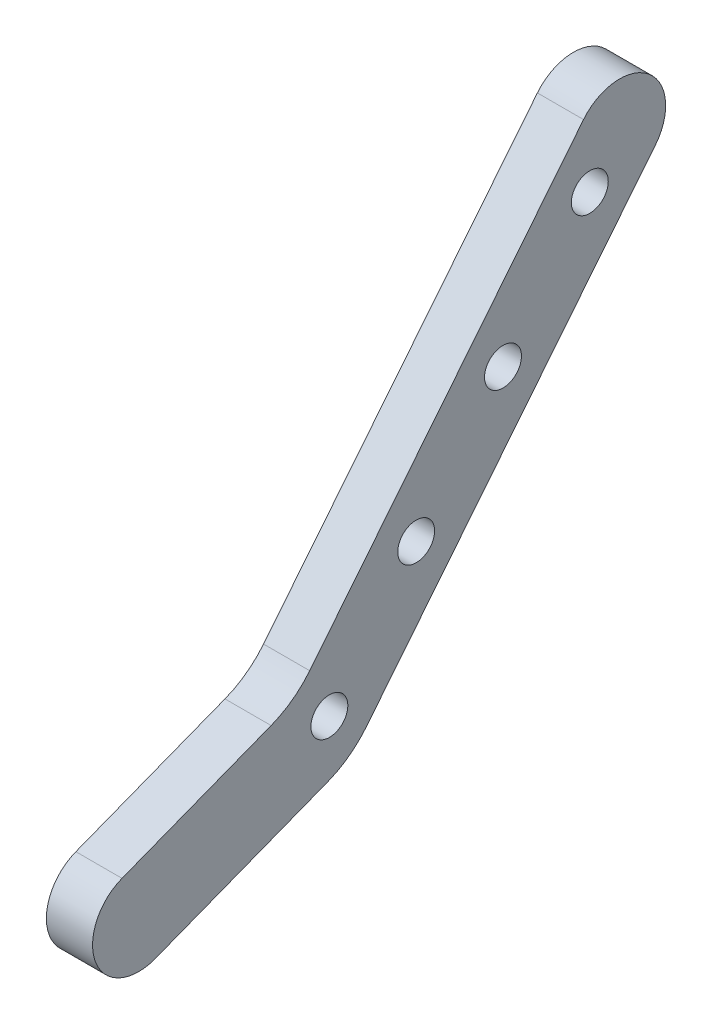
ISO-10303-21;
HEADER;
FILE_DESCRIPTION(('STEP AP214'),'2;1');
FILE_NAME('part.step','',(''),(''),'','','');
FILE_SCHEMA(('AUTOMOTIVE_DESIGN { 1 0 10303 214 1 1 1 1 }'));
ENDSEC;
DATA;
#1=APPLICATION_CONTEXT('core data for automotive mechanical design processes');
#2=APPLICATION_PROTOCOL_DEFINITION('international standard','automotive_design',2000,#1);
#3=PRODUCT_CONTEXT('',#1,'mechanical');
#4=PRODUCT('Part','Part','',(#3));
#5=PRODUCT_RELATED_PRODUCT_CATEGORY('part','',(#4));
#6=PRODUCT_DEFINITION_FORMATION('','',#4);
#7=PRODUCT_DEFINITION_CONTEXT('part definition',#1,'design');
#8=PRODUCT_DEFINITION('design','',#6,#7);
#9=PRODUCT_DEFINITION_SHAPE('','',#8);
#10=(LENGTH_UNIT() NAMED_UNIT(*) SI_UNIT(.MILLI.,.METRE.));
#11=(NAMED_UNIT(*) PLANE_ANGLE_UNIT() SI_UNIT($,.RADIAN.));
#12=(NAMED_UNIT(*) SI_UNIT($,.STERADIAN.) SOLID_ANGLE_UNIT());
#13=UNCERTAINTY_MEASURE_WITH_UNIT(LENGTH_MEASURE(1.E-05),#10,'distance_accuracy_value','');
#14=(GEOMETRIC_REPRESENTATION_CONTEXT(3) GLOBAL_UNCERTAINTY_ASSIGNED_CONTEXT((#13)) GLOBAL_UNIT_ASSIGNED_CONTEXT((#10,
#11,#12)) REPRESENTATION_CONTEXT('',''));
#15=CARTESIAN_POINT('',(0.,0.,0.));
#16=DIRECTION('',(0.,0.,1.));
#17=DIRECTION('',(1.,0.,0.));
#18=AXIS2_PLACEMENT_3D('',#15,#16,#17);
#19=CARTESIAN_POINT('',(5.,-3.13435260278536,-3.89561725037415));
#20=DIRECTION('',(0.,0.626870520557072,0.77912345007483));
#21=DIRECTION('',(0.,-0.77912345007483,0.626870520557072));
#22=AXIS2_PLACEMENT_3D('',#19,#20,#21);
#23=PLANE('',#22);
#24=DIRECTION('',(0.,0.779123450074831,-0.626870520557071));
#25=VECTOR('',#24,1.);
#26=CARTESIAN_POINT('',(5.,-3.13435260278536,-3.89561725037415));
#27=LINE('',#26,#25);
#28=CARTESIAN_POINT('',(5.,-2.09052510652686,-4.73546449908486));
#29=VERTEX_POINT('',#28);
#30=CARTESIAN_POINT('',(5.,36.8656473972146,-36.0789905269384));
#31=VERTEX_POINT('',#30);
#32=EDGE_CURVE('E103',#29,#31,#27,.T.);
#33=ORIENTED_EDGE('',*,*,#32,.F.);
#34=DIRECTION('',(-1.,0.,0.));
#35=VECTOR('',#34,1.);
#36=CARTESIAN_POINT('',(5.,-2.09052510652686,-4.73546449908486));
#37=LINE('',#36,#35);
#38=CARTESIAN_POINT('',(0.,-2.09052510652686,-4.73546449908486));
#39=VERTEX_POINT('',#38);
#40=EDGE_CURVE('E184',#29,#39,#37,.T.);
#41=ORIENTED_EDGE('',*,*,#40,.T.);
#42=DIRECTION('',(0.,0.77912345007483,-0.626870520557072));
#43=VECTOR('',#42,1.);
#44=CARTESIAN_POINT('',(0.,-3.13435260278536,-3.89561725037415));
#45=LINE('',#44,#43);
#46=CARTESIAN_POINT('',(0.,36.8656473972146,-36.0789905269384));
#47=VERTEX_POINT('',#46);
#48=EDGE_CURVE('E119',#39,#47,#45,.T.);
#49=ORIENTED_EDGE('',*,*,#48,.T.);
#50=DIRECTION('',(-1.,0.,0.));
#51=VECTOR('',#50,1.);
#52=CARTESIAN_POINT('',(5.,36.8656473972146,-36.0789905269384));
#53=LINE('',#52,#51);
#54=EDGE_CURVE('E118',#31,#47,#53,.T.);
#55=ORIENTED_EDGE('',*,*,#54,.F.);
#56=EDGE_LOOP('',(#33,#41,#49,#55));
#57=FACE_BOUND('',#56,.T.);
#58=ADVANCED_FACE('F39',(#57),#23,.F.);
#59=CARTESIAN_POINT('',(5.,40.,-32.1833732765643));
#60=DIRECTION('',(-1.,0.,0.));
#61=DIRECTION('',(0.,0.,1.));
#62=AXIS2_PLACEMENT_3D('',#59,#60,#61);
#63=CYLINDRICAL_SURFACE('',#62,5.);
#64=CARTESIAN_POINT('',(0.,40.,-32.1833732765643));
#65=DIRECTION('',(1.,0.,0.));
#66=DIRECTION('',(0.,0.,1.));
#67=AXIS2_PLACEMENT_3D('',#64,#65,#66);
#68=CIRCLE('',#67,5.);
#69=CARTESIAN_POINT('',(0.,43.1343526027854,-28.2877560261901));
#70=VERTEX_POINT('',#69);
#71=EDGE_CURVE('E146',#47,#70,#68,.T.);
#72=ORIENTED_EDGE('',*,*,#71,.T.);
#73=DIRECTION('',(-1.,0.,0.));
#74=VECTOR('',#73,1.);
#75=CARTESIAN_POINT('',(5.,43.1343526027854,-28.2877560261901));
#76=LINE('',#75,#74);
#77=CARTESIAN_POINT('',(5.,43.1343526027854,-28.2877560261901));
#78=VERTEX_POINT('',#77);
#79=EDGE_CURVE('E124',#78,#70,#76,.T.);
#80=ORIENTED_EDGE('',*,*,#79,.F.);
#81=CARTESIAN_POINT('',(5.,40.,-32.1833732765643));
#82=DIRECTION('',(1.,0.,0.));
#83=DIRECTION('',(0.,0.,1.));
#84=AXIS2_PLACEMENT_3D('',#81,#82,#83);
#85=CIRCLE('',#84,5.);
#86=EDGE_CURVE('E108',#31,#78,#85,.T.);
#87=ORIENTED_EDGE('',*,*,#86,.F.);
#88=ORIENTED_EDGE('',*,*,#54,.T.);
#89=EDGE_LOOP('',(#72,#80,#87,#88));
#90=FACE_BOUND('',#89,.T.);
#91=ADVANCED_FACE('F126',(#90),#63,.T.);
#92=CARTESIAN_POINT('',(5.,4.17818009904385,3.05577000166343));
#93=DIRECTION('',(0.,-0.626870520557072,-0.77912345007483));
#94=DIRECTION('',(0.,0.77912345007483,-0.626870520557072));
#95=AXIS2_PLACEMENT_3D('',#92,#93,#94);
#96=PLANE('',#95);
#97=DIRECTION('',(0.,-0.77912345007483,0.626870520557072));
#98=VECTOR('',#97,1.);
#99=CARTESIAN_POINT('',(0.,4.17818009904385,3.05577000166343));
#100=LINE('',#99,#98);
#101=CARTESIAN_POINT('',(0.,6.26583509156084,1.376075504242));
#102=VERTEX_POINT('',#101);
#103=EDGE_CURVE('E150',#70,#102,#100,.T.);
#104=ORIENTED_EDGE('',*,*,#103,.T.);
#105=DIRECTION('',(-1.,0.,0.));
#106=VECTOR('',#105,1.);
#107=CARTESIAN_POINT('',(5.,6.26583509156084,1.376075504242));
#108=LINE('',#107,#106);
#109=CARTESIAN_POINT('',(5.,6.26583509156084,1.376075504242));
#110=VERTEX_POINT('',#109);
#111=EDGE_CURVE('E175',#102,#110,#108,.F.);
#112=ORIENTED_EDGE('',*,*,#111,.T.);
#113=DIRECTION('',(0.,-0.77912345007483,0.626870520557072));
#114=VECTOR('',#113,1.);
#115=CARTESIAN_POINT('',(5.,4.17818009904385,3.05577000166343));
#116=LINE('',#115,#114);
#117=EDGE_CURVE('E130',#78,#110,#116,.T.);
#118=ORIENTED_EDGE('',*,*,#117,.F.);
#119=ORIENTED_EDGE('',*,*,#79,.T.);
#120=EDGE_LOOP('',(#104,#112,#118,#119));
#121=FACE_BOUND('',#120,.T.);
#122=ADVANCED_FACE('F193',(#121),#96,.F.);
#123=CARTESIAN_POINT('',(5.,4.17818009904385,3.05577000166343));
#124=DIRECTION('',(0.,-0.932447520723412,-0.36130544017045));
#125=DIRECTION('',(0.,0.36130544017045,-0.932447520723412));
#126=AXIS2_PLACEMENT_3D('',#123,#124,#125);
#127=PLANE('',#126);
#128=DIRECTION('',(0.,-0.36130544017045,0.932447520723412));
#129=VECTOR('',#128,1.);
#130=CARTESIAN_POINT('',(5.,4.17818009904385,3.05577000166343));
#131=LINE('',#130,#129);
#132=CARTESIAN_POINT('',(5.,3.21006508989743,5.55425560328581));
#133=VERTEX_POINT('',#132);
#134=CARTESIAN_POINT('',(5.,-3.04792870436514,21.7047204161317));
#135=VERTEX_POINT('',#134);
#136=EDGE_CURVE('E133',#133,#135,#131,.T.);
#137=ORIENTED_EDGE('',*,*,#136,.F.);
#138=DIRECTION('',(-1.,0.,0.));
#139=VECTOR('',#138,1.);
#140=CARTESIAN_POINT('',(0.,3.21006508989743,5.55425560328581));
#141=LINE('',#140,#139);
#142=CARTESIAN_POINT('',(0.,3.21006508989743,5.55425560328581));
#143=VERTEX_POINT('',#142);
#144=EDGE_CURVE('E123',#133,#143,#141,.T.);
#145=ORIENTED_EDGE('',*,*,#144,.T.);
#146=DIRECTION('',(0.,-0.36130544017045,0.932447520723412));
#147=VECTOR('',#146,1.);
#148=CARTESIAN_POINT('',(0.,4.17818009904385,3.05577000166343));
#149=LINE('',#148,#147);
#150=CARTESIAN_POINT('',(0.,-3.04792870436514,21.7047204161317));
#151=VERTEX_POINT('',#150);
#152=EDGE_CURVE('E154',#143,#151,#149,.T.);
#153=ORIENTED_EDGE('',*,*,#152,.T.);
#154=DIRECTION('',(-1.,0.,0.));
#155=VECTOR('',#154,1.);
#156=CARTESIAN_POINT('',(5.,-3.04792870436514,21.7047204161317));
#157=LINE('',#156,#155);
#158=EDGE_CURVE('E166',#135,#151,#157,.T.);
#159=ORIENTED_EDGE('',*,*,#158,.F.);
#160=EDGE_LOOP('',(#137,#145,#153,#159));
#161=FACE_BOUND('',#160,.T.);
#162=ADVANCED_FACE('F202',(#161),#127,.F.);
#163=CARTESIAN_POINT('',(5.,-7.7101663079822,19.8981932152794));
#164=DIRECTION('',(-1.,0.,0.));
#165=DIRECTION('',(0.,0.,1.));
#166=AXIS2_PLACEMENT_3D('',#163,#164,#165);
#167=CYLINDRICAL_SURFACE('',#166,5.);
#168=CARTESIAN_POINT('',(0.,-7.7101663079822,19.8981932152794));
#169=DIRECTION('',(1.,0.,0.));
#170=DIRECTION('',(0.,0.,-1.));
#171=AXIS2_PLACEMENT_3D('',#168,#169,#170);
#172=CIRCLE('',#171,5.);
#173=CARTESIAN_POINT('',(0.,-12.3724039115993,18.0916660144272));
#174=VERTEX_POINT('',#173);
#175=EDGE_CURVE('E157',#151,#174,#172,.T.);
#176=ORIENTED_EDGE('',*,*,#175,.T.);
#177=DIRECTION('',(-1.,0.,0.));
#178=VECTOR('',#177,1.);
#179=CARTESIAN_POINT('',(5.,-12.3724039115993,18.0916660144272));
#180=LINE('',#179,#178);
#181=CARTESIAN_POINT('',(5.,-12.3724039115993,18.0916660144272));
#182=VERTEX_POINT('',#181);
#183=EDGE_CURVE('E143',#182,#174,#180,.T.);
#184=ORIENTED_EDGE('',*,*,#183,.F.);
#185=CARTESIAN_POINT('',(5.,-7.7101663079822,19.8981932152794));
#186=DIRECTION('',(1.,0.,0.));
#187=DIRECTION('',(0.,0.,-1.));
#188=AXIS2_PLACEMENT_3D('',#185,#186,#187);
#189=CIRCLE('',#188,5.);
#190=EDGE_CURVE('E139',#135,#182,#189,.T.);
#191=ORIENTED_EDGE('',*,*,#190,.F.);
#192=ORIENTED_EDGE('',*,*,#158,.T.);
#193=EDGE_LOOP('',(#176,#184,#191,#192));
#194=FACE_BOUND('',#193,.T.);
#195=ADVANCED_FACE('F207',(#194),#167,.T.);
#196=CARTESIAN_POINT('',(5.,-4.66223760361706,-1.80652720085225));
#197=DIRECTION('',(0.,0.932447520723412,0.36130544017045));
#198=DIRECTION('',(0.,-0.36130544017045,0.932447520723412));
#199=AXIS2_PLACEMENT_3D('',#196,#197,#198);
#200=PLANE('',#199);
#201=DIRECTION('',(0.,0.36130544017045,-0.932447520723412));
#202=VECTOR('',#201,1.);
#203=CARTESIAN_POINT('',(0.,-4.66223760361706,-1.80652720085225));
#204=LINE('',#203,#202);
#205=CARTESIAN_POINT('',(0.,-5.14629510819027,-0.557284400041059));
#206=VERTEX_POINT('',#205);
#207=EDGE_CURVE('E160',#174,#206,#204,.T.);
#208=ORIENTED_EDGE('',*,*,#207,.T.);
#209=DIRECTION('',(-1.,0.,0.));
#210=VECTOR('',#209,1.);
#211=CARTESIAN_POINT('',(5.,-5.14629510819027,-0.557284400041059));
#212=LINE('',#211,#210);
#213=CARTESIAN_POINT('',(5.,-5.14629510819027,-0.557284400041059));
#214=VERTEX_POINT('',#213);
#215=EDGE_CURVE('E48',#206,#214,#212,.F.);
#216=ORIENTED_EDGE('',*,*,#215,.T.);
#217=DIRECTION('',(0.,0.36130544017045,-0.932447520723412));
#218=VECTOR('',#217,1.);
#219=CARTESIAN_POINT('',(5.,-4.66223760361706,-1.80652720085225));
#220=LINE('',#219,#218);
#221=EDGE_CURVE('E115',#182,#214,#220,.T.);
#222=ORIENTED_EDGE('',*,*,#221,.F.);
#223=ORIENTED_EDGE('',*,*,#183,.T.);
#224=EDGE_LOOP('',(#208,#216,#222,#223));
#225=FACE_BOUND('',#224,.T.);
#226=ADVANCED_FACE('F209',(#225),#200,.F.);
#227=CARTESIAN_POINT('',(5.,40.,-32.1833732765643));
#228=DIRECTION('',(-1.,0.,0.));
#229=DIRECTION('',(0.,0.,1.));
#230=AXIS2_PLACEMENT_3D('',#227,#228,#229);
#231=PLANE('',#230);
#232=CARTESIAN_POINT('',(5.,36.,-28.9650359489079));
#233=DIRECTION('',(1.,0.,0.));
#234=DIRECTION('',(0.,0.,-1.));
#235=AXIS2_PLACEMENT_3D('',#232,#233,#234);
#236=CIRCLE('',#235,2.);
#237=CARTESIAN_POINT('',(5.,36.,-30.9650359489079));
#238=VERTEX_POINT('',#237);
#239=EDGE_CURVE('E236',#238,#238,#236,.T.);
#240=ORIENTED_EDGE('',*,*,#239,.F.);
#241=EDGE_LOOP('',(#240));
#242=FACE_BOUND('',#241,.T.);
#243=CARTESIAN_POINT('',(5.,24.3131482488776,-19.5619781405518));
#244=DIRECTION('',(1.,0.,0.));
#245=DIRECTION('',(0.,0.,-1.));
#246=AXIS2_PLACEMENT_3D('',#243,#244,#245);
#247=CIRCLE('',#246,2.);
#248=CARTESIAN_POINT('',(5.,24.3131482488776,-21.5619781405518));
#249=VERTEX_POINT('',#248);
#250=EDGE_CURVE('E228',#249,#249,#247,.T.);
#251=ORIENTED_EDGE('',*,*,#250,.F.);
#252=EDGE_LOOP('',(#251));
#253=FACE_BOUND('',#252,.T.);
#254=CARTESIAN_POINT('',(5.,12.6262964977551,-10.1589203321957));
#255=DIRECTION('',(1.,0.,0.));
#256=DIRECTION('',(0.,0.,-1.));
#257=AXIS2_PLACEMENT_3D('',#254,#255,#256);
#258=CIRCLE('',#257,2.);
#259=CARTESIAN_POINT('',(5.,12.6262964977551,-12.1589203321957));
#260=VERTEX_POINT('',#259);
#261=EDGE_CURVE('E220',#260,#260,#258,.T.);
#262=ORIENTED_EDGE('',*,*,#261,.F.);
#263=EDGE_LOOP('',(#262));
#264=FACE_BOUND('',#263,.T.);
#265=CARTESIAN_POINT('',(5.,0.939444746632656,-0.755862523839648));
#266=DIRECTION('',(1.,0.,0.));
#267=DIRECTION('',(0.,0.,-1.));
#268=AXIS2_PLACEMENT_3D('',#265,#266,#267);
#269=CIRCLE('',#268,2.);
#270=CARTESIAN_POINT('',(5.,0.939444746632656,-2.75586252383965));
#271=VERTEX_POINT('',#270);
#272=EDGE_CURVE('E212',#271,#271,#269,.T.);
#273=ORIENTED_EDGE('',*,*,#272,.F.);
#274=EDGE_LOOP('',(#273));
#275=FACE_BOUND('',#274,.T.);
#276=ORIENTED_EDGE('',*,*,#221,.T.);
#277=CARTESIAN_POINT('',(5.,4.17818009904385,3.05577000166344));
#278=DIRECTION('',(-1.,0.,0.));
#279=DIRECTION('',(0.,0.,1.));
#280=AXIS2_PLACEMENT_3D('',#277,#278,#279);
#281=CIRCLE('',#280,10.);
#282=EDGE_CURVE('E11',#214,#29,#281,.F.);
#283=ORIENTED_EDGE('',*,*,#282,.T.);
#284=ORIENTED_EDGE('',*,*,#32,.T.);
#285=ORIENTED_EDGE('',*,*,#86,.T.);
#286=ORIENTED_EDGE('',*,*,#117,.T.);
#287=CARTESIAN_POINT('',(5.,12.5345402971316,9.1673100049903));
#288=DIRECTION('',(-1.,0.,0.));
#289=DIRECTION('',(0.,0.,1.));
#290=AXIS2_PLACEMENT_3D('',#287,#288,#289);
#291=CIRCLE('',#290,10.);
#292=EDGE_CURVE('E181',#110,#133,#291,.T.);
#293=ORIENTED_EDGE('',*,*,#292,.T.);
#294=ORIENTED_EDGE('',*,*,#136,.T.);
#295=ORIENTED_EDGE('',*,*,#190,.T.);
#296=EDGE_LOOP('',(#276,#283,#284,#285,#286,#293,#294,#295));
#297=FACE_BOUND('',#296,.T.);
#298=ADVANCED_FACE('F105',(#242,#253,#264,#275,#297),#231,.F.);
#299=CARTESIAN_POINT('',(0.,40.,-32.1833732765643));
#300=DIRECTION('',(-1.,0.,0.));
#301=DIRECTION('',(0.,0.,1.));
#302=AXIS2_PLACEMENT_3D('',#299,#300,#301);
#303=PLANE('',#302);
#304=CARTESIAN_POINT('',(0.,36.,-28.9650359489079));
#305=DIRECTION('',(1.,0.,0.));
#306=DIRECTION('',(0.,0.,-1.));
#307=AXIS2_PLACEMENT_3D('',#304,#305,#306);
#308=CIRCLE('',#307,2.);
#309=CARTESIAN_POINT('',(0.,36.,-30.9650359489079));
#310=VERTEX_POINT('',#309);
#311=EDGE_CURVE('E147',#310,#310,#308,.T.);
#312=ORIENTED_EDGE('',*,*,#311,.T.);
#313=EDGE_LOOP('',(#312));
#314=FACE_BOUND('',#313,.T.);
#315=CARTESIAN_POINT('',(0.,24.3131482488776,-19.5619781405518));
#316=DIRECTION('',(1.,0.,0.));
#317=DIRECTION('',(0.,0.,-1.));
#318=AXIS2_PLACEMENT_3D('',#315,#316,#317);
#319=CIRCLE('',#318,2.);
#320=CARTESIAN_POINT('',(0.,24.3131482488776,-21.5619781405518));
#321=VERTEX_POINT('',#320);
#322=EDGE_CURVE('E232',#321,#321,#319,.T.);
#323=ORIENTED_EDGE('',*,*,#322,.T.);
#324=EDGE_LOOP('',(#323));
#325=FACE_BOUND('',#324,.T.);
#326=CARTESIAN_POINT('',(0.,12.6262964977551,-10.1589203321957));
#327=DIRECTION('',(1.,0.,0.));
#328=DIRECTION('',(0.,0.,-1.));
#329=AXIS2_PLACEMENT_3D('',#326,#327,#328);
#330=CIRCLE('',#329,2.);
#331=CARTESIAN_POINT('',(0.,12.6262964977551,-12.1589203321957));
#332=VERTEX_POINT('',#331);
#333=EDGE_CURVE('E224',#332,#332,#330,.T.);
#334=ORIENTED_EDGE('',*,*,#333,.T.);
#335=EDGE_LOOP('',(#334));
#336=FACE_BOUND('',#335,.T.);
#337=CARTESIAN_POINT('',(0.,0.939444746632656,-0.755862523839648));
#338=DIRECTION('',(1.,0.,0.));
#339=DIRECTION('',(0.,0.,-1.));
#340=AXIS2_PLACEMENT_3D('',#337,#338,#339);
#341=CIRCLE('',#340,2.);
#342=CARTESIAN_POINT('',(0.,0.939444746632656,-2.75586252383965));
#343=VERTEX_POINT('',#342);
#344=EDGE_CURVE('E216',#343,#343,#341,.T.);
#345=ORIENTED_EDGE('',*,*,#344,.T.);
#346=EDGE_LOOP('',(#345));
#347=FACE_BOUND('',#346,.T.);
#348=ORIENTED_EDGE('',*,*,#48,.F.);
#349=CARTESIAN_POINT('',(0.,4.17818009904385,3.05577000166344));
#350=DIRECTION('',(-1.,0.,0.));
#351=DIRECTION('',(0.,0.,1.));
#352=AXIS2_PLACEMENT_3D('',#349,#350,#351);
#353=CIRCLE('',#352,10.);
#354=EDGE_CURVE('E62',#39,#206,#353,.T.);
#355=ORIENTED_EDGE('',*,*,#354,.T.);
#356=ORIENTED_EDGE('',*,*,#207,.F.);
#357=ORIENTED_EDGE('',*,*,#175,.F.);
#358=ORIENTED_EDGE('',*,*,#152,.F.);
#359=CARTESIAN_POINT('',(0.,12.5345402971316,9.1673100049903));
#360=DIRECTION('',(-1.,0.,0.));
#361=DIRECTION('',(0.,0.,1.));
#362=AXIS2_PLACEMENT_3D('',#359,#360,#361);
#363=CIRCLE('',#362,10.);
#364=EDGE_CURVE('E178',#143,#102,#363,.F.);
#365=ORIENTED_EDGE('',*,*,#364,.T.);
#366=ORIENTED_EDGE('',*,*,#103,.F.);
#367=ORIENTED_EDGE('',*,*,#71,.F.);
#368=EDGE_LOOP('',(#348,#355,#356,#357,#358,#365,#366,#367));
#369=FACE_BOUND('',#368,.T.);
#370=ADVANCED_FACE('F190',(#314,#325,#336,#347,#369),#303,.T.);
#371=CARTESIAN_POINT('',(0.,0.939444746632656,-0.755862523839648));
#372=DIRECTION('',(1.,0.,0.));
#373=DIRECTION('',(0.,0.,-1.));
#374=AXIS2_PLACEMENT_3D('',#371,#372,#373);
#375=CYLINDRICAL_SURFACE('',#374,2.);
#376=ORIENTED_EDGE('',*,*,#344,.F.);
#377=EDGE_LOOP('',(#376));
#378=FACE_BOUND('',#377,.T.);
#379=ORIENTED_EDGE('',*,*,#272,.T.);
#380=EDGE_LOOP('',(#379));
#381=FACE_BOUND('',#380,.T.);
#382=ADVANCED_FACE('F262',(#378,#381),#375,.F.);
#383=CARTESIAN_POINT('',(0.,12.6262964977551,-10.1589203321957));
#384=DIRECTION('',(1.,0.,0.));
#385=DIRECTION('',(0.,0.,-1.));
#386=AXIS2_PLACEMENT_3D('',#383,#384,#385);
#387=CYLINDRICAL_SURFACE('',#386,2.);
#388=ORIENTED_EDGE('',*,*,#333,.F.);
#389=EDGE_LOOP('',(#388));
#390=FACE_BOUND('',#389,.T.);
#391=ORIENTED_EDGE('',*,*,#261,.T.);
#392=EDGE_LOOP('',(#391));
#393=FACE_BOUND('',#392,.T.);
#394=ADVANCED_FACE('F264',(#390,#393),#387,.F.);
#395=CARTESIAN_POINT('',(0.,24.3131482488776,-19.5619781405518));
#396=DIRECTION('',(1.,0.,0.));
#397=DIRECTION('',(0.,0.,-1.));
#398=AXIS2_PLACEMENT_3D('',#395,#396,#397);
#399=CYLINDRICAL_SURFACE('',#398,2.);
#400=ORIENTED_EDGE('',*,*,#322,.F.);
#401=EDGE_LOOP('',(#400));
#402=FACE_BOUND('',#401,.T.);
#403=ORIENTED_EDGE('',*,*,#250,.T.);
#404=EDGE_LOOP('',(#403));
#405=FACE_BOUND('',#404,.T.);
#406=ADVANCED_FACE('F249',(#402,#405),#399,.F.);
#407=CARTESIAN_POINT('',(0.,36.,-28.9650359489079));
#408=DIRECTION('',(1.,0.,0.));
#409=DIRECTION('',(0.,0.,-1.));
#410=AXIS2_PLACEMENT_3D('',#407,#408,#409);
#411=CYLINDRICAL_SURFACE('',#410,2.);
#412=ORIENTED_EDGE('',*,*,#311,.F.);
#413=EDGE_LOOP('',(#412));
#414=FACE_BOUND('',#413,.T.);
#415=ORIENTED_EDGE('',*,*,#239,.T.);
#416=EDGE_LOOP('',(#415));
#417=FACE_BOUND('',#416,.T.);
#418=ADVANCED_FACE('F246',(#414,#417),#411,.F.);
#419=CARTESIAN_POINT('',(5.,12.5345402971316,9.1673100049903));
#420=DIRECTION('',(1.,0.,0.));
#421=DIRECTION('',(0.,0.,-1.));
#422=AXIS2_PLACEMENT_3D('',#419,#420,#421);
#423=CYLINDRICAL_SURFACE('',#422,10.);
#424=ORIENTED_EDGE('',*,*,#292,.F.);
#425=ORIENTED_EDGE('',*,*,#111,.F.);
#426=ORIENTED_EDGE('',*,*,#364,.F.);
#427=ORIENTED_EDGE('',*,*,#144,.F.);
#428=EDGE_LOOP('',(#424,#425,#426,#427));
#429=FACE_BOUND('',#428,.T.);
#430=ADVANCED_FACE('F199',(#429),#423,.F.);
#431=CARTESIAN_POINT('',(5.,4.17818009904385,3.05577000166344));
#432=DIRECTION('',(-1.,0.,0.));
#433=DIRECTION('',(0.,0.,1.));
#434=AXIS2_PLACEMENT_3D('',#431,#432,#433);
#435=CYLINDRICAL_SURFACE('',#434,10.);
#436=ORIENTED_EDGE('',*,*,#282,.F.);
#437=ORIENTED_EDGE('',*,*,#215,.F.);
#438=ORIENTED_EDGE('',*,*,#354,.F.);
#439=ORIENTED_EDGE('',*,*,#40,.F.);
#440=EDGE_LOOP('',(#436,#437,#438,#439));
#441=FACE_BOUND('',#440,.T.);
#442=ADVANCED_FACE('F41',(#441),#435,.T.);
#443=CLOSED_SHELL('',(#58,#91,#122,#162,#195,#226,#298,#370,#382,#394,#406,#418,#430,#442));
#444=MANIFOLD_SOLID_BREP('B2',#443);
#445=ADVANCED_BREP_SHAPE_REPRESENTATION('',(#18,#444),#14);
#446=SHAPE_DEFINITION_REPRESENTATION(#9,#445);
ENDSEC;
END-ISO-10303-21;
